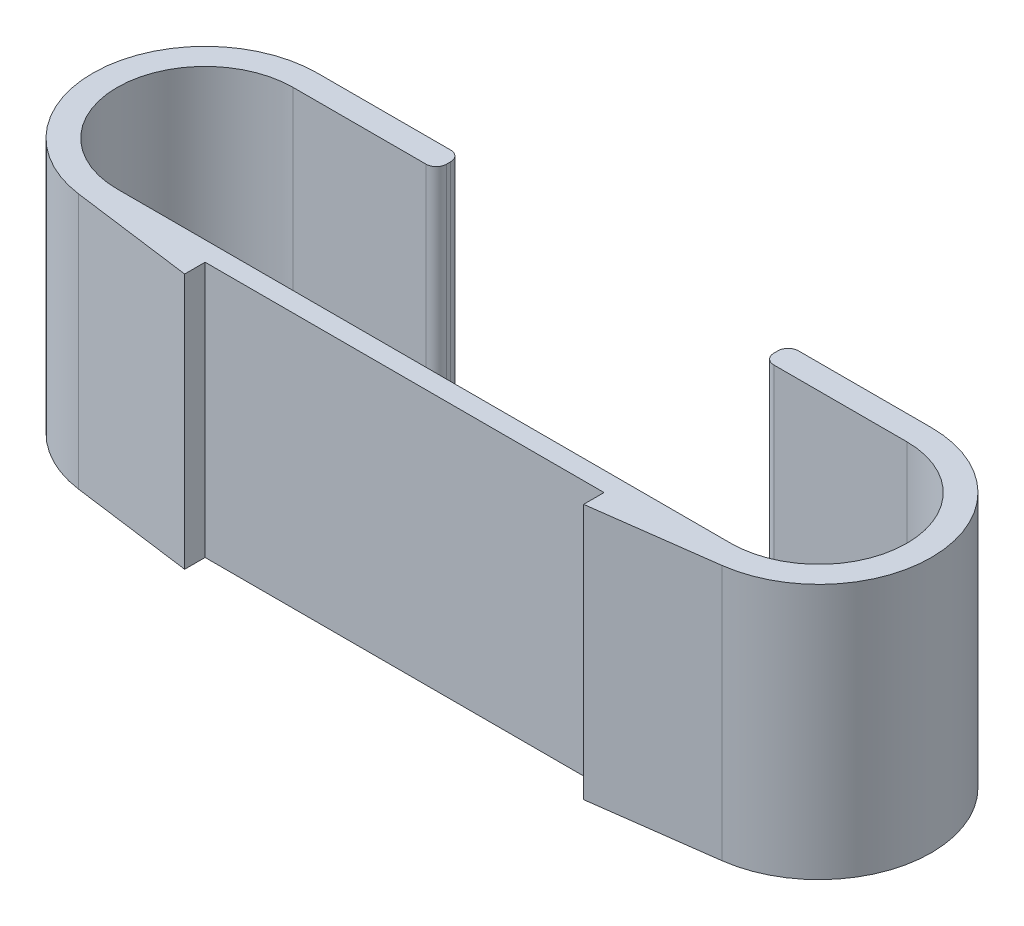
ISO-10303-21;
HEADER;
FILE_DESCRIPTION(('STEP AP214'),'2;1');
FILE_NAME('part.step','',(''),(''),'','','');
FILE_SCHEMA(('AUTOMOTIVE_DESIGN { 1 0 10303 214 1 1 1 1 }'));
ENDSEC;
DATA;
#1=APPLICATION_CONTEXT('core data for automotive mechanical design processes');
#2=APPLICATION_PROTOCOL_DEFINITION('international standard','automotive_design',2000,#1);
#3=PRODUCT_CONTEXT('',#1,'mechanical');
#4=PRODUCT('Part','Part','',(#3));
#5=PRODUCT_RELATED_PRODUCT_CATEGORY('part','',(#4));
#6=PRODUCT_DEFINITION_FORMATION('','',#4);
#7=PRODUCT_DEFINITION_CONTEXT('part definition',#1,'design');
#8=PRODUCT_DEFINITION('design','',#6,#7);
#9=PRODUCT_DEFINITION_SHAPE('','',#8);
#10=(LENGTH_UNIT() NAMED_UNIT(*) SI_UNIT(.MILLI.,.METRE.));
#11=(NAMED_UNIT(*) PLANE_ANGLE_UNIT() SI_UNIT($,.RADIAN.));
#12=(NAMED_UNIT(*) SI_UNIT($,.STERADIAN.) SOLID_ANGLE_UNIT());
#13=UNCERTAINTY_MEASURE_WITH_UNIT(LENGTH_MEASURE(1.E-05),#10,'distance_accuracy_value','');
#14=(GEOMETRIC_REPRESENTATION_CONTEXT(3) GLOBAL_UNCERTAINTY_ASSIGNED_CONTEXT((#13)) GLOBAL_UNIT_ASSIGNED_CONTEXT((#10,
#11,#12)) REPRESENTATION_CONTEXT('',''));
#15=CARTESIAN_POINT('',(0.,0.,0.));
#16=DIRECTION('',(0.,0.,1.));
#17=DIRECTION('',(1.,0.,0.));
#18=AXIS2_PLACEMENT_3D('',#15,#16,#17);
#19=CARTESIAN_POINT('',(30.,25.,-11.));
#20=DIRECTION('',(0.,-1.,0.));
#21=DIRECTION('',(0.,0.,-1.));
#22=AXIS2_PLACEMENT_3D('',#19,#20,#21);
#23=CYLINDRICAL_SURFACE('',#22,8.6);
#24=DIRECTION('',(0.,-1.,0.));
#25=VECTOR('',#24,1.);
#26=CARTESIAN_POINT('',(30.,25.,-19.6));
#27=LINE('',#26,#25);
#28=CARTESIAN_POINT('',(30.,25.,-19.6));
#29=VERTEX_POINT('',#28);
#30=CARTESIAN_POINT('',(30.,1.2,-19.6));
#31=VERTEX_POINT('',#30);
#32=EDGE_CURVE('E336',#29,#31,#27,.T.);
#33=ORIENTED_EDGE('',*,*,#32,.T.);
#34=CARTESIAN_POINT('',(30.,1.2,-11.));
#35=DIRECTION('',(0.,-1.,0.));
#36=DIRECTION('',(0.,0.,-1.));
#37=AXIS2_PLACEMENT_3D('',#34,#35,#36);
#38=CIRCLE('',#37,8.6);
#39=CARTESIAN_POINT('',(30.,1.2,-2.4));
#40=VERTEX_POINT('',#39);
#41=EDGE_CURVE('E289',#31,#40,#38,.T.);
#42=ORIENTED_EDGE('',*,*,#41,.T.);
#43=DIRECTION('',(0.,-1.,0.));
#44=VECTOR('',#43,1.);
#45=CARTESIAN_POINT('',(30.,25.,-2.4));
#46=LINE('',#45,#44);
#47=CARTESIAN_POINT('',(30.,25.,-2.4));
#48=VERTEX_POINT('',#47);
#49=EDGE_CURVE('E333',#48,#40,#46,.T.);
#50=ORIENTED_EDGE('',*,*,#49,.F.);
#51=CARTESIAN_POINT('',(30.,25.,-11.));
#52=DIRECTION('',(0.,-1.,0.));
#53=DIRECTION('',(-1.,0.,0.));
#54=AXIS2_PLACEMENT_3D('',#51,#52,#53);
#55=CIRCLE('',#54,8.6);
#56=EDGE_CURVE('E301',#48,#29,#55,.F.);
#57=ORIENTED_EDGE('',*,*,#56,.T.);
#58=EDGE_LOOP('',(#33,#42,#50,#57));
#59=FACE_BOUND('',#58,.T.);
#60=ADVANCED_FACE('F41',(#59),#23,.F.);
#61=CARTESIAN_POINT('',(-30.,25.,-11.));
#62=DIRECTION('',(0.,-1.,0.));
#63=DIRECTION('',(0.,0.,-1.));
#64=AXIS2_PLACEMENT_3D('',#61,#62,#63);
#65=CYLINDRICAL_SURFACE('',#64,11.);
#66=CARTESIAN_POINT('',(-30.,0.,-11.));
#67=DIRECTION('',(0.,-1.,0.));
#68=DIRECTION('',(0.,0.,-1.));
#69=AXIS2_PLACEMENT_3D('',#66,#67,#68);
#70=CIRCLE('',#69,11.);
#71=CARTESIAN_POINT('',(-31.4561781848013,0.,-0.0968103247669376));
#72=VERTEX_POINT('',#71);
#73=CARTESIAN_POINT('',(-30.,0.,-22.));
#74=VERTEX_POINT('',#73);
#75=EDGE_CURVE('E397',#72,#74,#70,.T.);
#76=ORIENTED_EDGE('',*,*,#75,.F.);
#77=DIRECTION('',(0.,-1.,0.));
#78=VECTOR('',#77,1.);
#79=CARTESIAN_POINT('',(-31.4561781848013,37.0623380818148,-0.0968103247669366));
#80=LINE('',#79,#78);
#81=CARTESIAN_POINT('',(-31.4561781848013,25.,-0.0968103247669376));
#82=VERTEX_POINT('',#81);
#83=EDGE_CURVE('E350',#82,#72,#80,.T.);
#84=ORIENTED_EDGE('',*,*,#83,.F.);
#85=CARTESIAN_POINT('',(-30.,25.,-11.));
#86=DIRECTION('',(0.,-1.,0.));
#87=DIRECTION('',(0.,0.,-1.));
#88=AXIS2_PLACEMENT_3D('',#85,#86,#87);
#89=CIRCLE('',#88,11.);
#90=CARTESIAN_POINT('',(-30.,25.,-22.));
#91=VERTEX_POINT('',#90);
#92=EDGE_CURVE('E377',#82,#91,#89,.T.);
#93=ORIENTED_EDGE('',*,*,#92,.T.);
#94=DIRECTION('',(0.,-1.,0.));
#95=VECTOR('',#94,1.);
#96=CARTESIAN_POINT('',(-30.,25.,-22.));
#97=LINE('',#96,#95);
#98=EDGE_CURVE('E409',#91,#74,#97,.T.);
#99=ORIENTED_EDGE('',*,*,#98,.T.);
#100=EDGE_LOOP('',(#76,#84,#93,#99));
#101=FACE_BOUND('',#100,.T.);
#102=ADVANCED_FACE('F607',(#101),#65,.T.);
#103=CARTESIAN_POINT('',(-30.,25.,-11.));
#104=DIRECTION('',(0.,-1.,0.));
#105=DIRECTION('',(0.,0.,-1.));
#106=AXIS2_PLACEMENT_3D('',#103,#104,#105);
#107=CYLINDRICAL_SURFACE('',#106,8.6);
#108=CARTESIAN_POINT('',(-30.,1.2,-11.));
#109=DIRECTION('',(0.,-1.,0.));
#110=DIRECTION('',(0.,0.,-1.));
#111=AXIS2_PLACEMENT_3D('',#108,#109,#110);
#112=CIRCLE('',#111,8.6);
#113=CARTESIAN_POINT('',(-30.,1.2,-19.6));
#114=VERTEX_POINT('',#113);
#115=CARTESIAN_POINT('',(-30.,1.2,-2.4));
#116=VERTEX_POINT('',#115);
#117=EDGE_CURVE('E413',#114,#116,#112,.F.);
#118=ORIENTED_EDGE('',*,*,#117,.F.);
#119=DIRECTION('',(0.,-1.,0.));
#120=VECTOR('',#119,1.);
#121=CARTESIAN_POINT('',(-30.,25.,-19.6));
#122=LINE('',#121,#120);
#123=CARTESIAN_POINT('',(-30.,25.,-19.6));
#124=VERTEX_POINT('',#123);
#125=EDGE_CURVE('E386',#124,#114,#122,.T.);
#126=ORIENTED_EDGE('',*,*,#125,.F.);
#127=CARTESIAN_POINT('',(-30.,25.,-11.));
#128=DIRECTION('',(0.,1.,0.));
#129=DIRECTION('',(1.,0.,0.));
#130=AXIS2_PLACEMENT_3D('',#127,#128,#129);
#131=CIRCLE('',#130,8.6);
#132=CARTESIAN_POINT('',(-30.,25.,-2.4));
#133=VERTEX_POINT('',#132);
#134=EDGE_CURVE('E383',#133,#124,#131,.F.);
#135=ORIENTED_EDGE('',*,*,#134,.F.);
#136=DIRECTION('',(0.,-1.,0.));
#137=VECTOR('',#136,1.);
#138=CARTESIAN_POINT('',(-30.,25.,-2.4));
#139=LINE('',#138,#137);
#140=EDGE_CURVE('E405',#133,#116,#139,.T.);
#141=ORIENTED_EDGE('',*,*,#140,.T.);
#142=EDGE_LOOP('',(#118,#126,#135,#141));
#143=FACE_BOUND('',#142,.T.);
#144=ADVANCED_FACE('F628',(#143),#107,.F.);
#145=CARTESIAN_POINT('',(-30.,25.,-19.6));
#146=DIRECTION('',(0.,0.,-1.));
#147=DIRECTION('',(-1.,0.,0.));
#148=AXIS2_PLACEMENT_3D('',#145,#146,#147);
#149=PLANE('',#148);
#150=ORIENTED_EDGE('',*,*,#125,.T.);
#151=DIRECTION('',(1.,0.,0.));
#152=VECTOR('',#151,1.);
#153=CARTESIAN_POINT('',(-30.,1.2,-19.6));
#154=LINE('',#153,#152);
#155=CARTESIAN_POINT('',(-25.,1.2,-19.6));
#156=VERTEX_POINT('',#155);
#157=EDGE_CURVE('E57',#114,#156,#154,.T.);
#158=ORIENTED_EDGE('',*,*,#157,.T.);
#159=DIRECTION('',(0.,1.,0.));
#160=VECTOR('',#159,1.);
#161=CARTESIAN_POINT('',(-25.,0.,-19.6));
#162=LINE('',#161,#160);
#163=CARTESIAN_POINT('',(-25.,0.,-19.6));
#164=VERTEX_POINT('',#163);
#165=EDGE_CURVE('E504',#156,#164,#162,.F.);
#166=ORIENTED_EDGE('',*,*,#165,.T.);
#167=DIRECTION('',(1.,0.,0.));
#168=VECTOR('',#167,1.);
#169=CARTESIAN_POINT('',(-30.,0.,-19.6));
#170=LINE('',#169,#168);
#171=CARTESIAN_POINT('',(-17.,0.,-19.6));
#172=VERTEX_POINT('',#171);
#173=EDGE_CURVE('E360',#164,#172,#170,.T.);
#174=ORIENTED_EDGE('',*,*,#173,.T.);
#175=DIRECTION('',(0.,-1.,0.));
#176=VECTOR('',#175,1.);
#177=CARTESIAN_POINT('',(-17.,25.,-19.6));
#178=LINE('',#177,#176);
#179=CARTESIAN_POINT('',(-17.,25.,-19.6));
#180=VERTEX_POINT('',#179);
#181=EDGE_CURVE('E452',#172,#180,#178,.F.);
#182=ORIENTED_EDGE('',*,*,#181,.T.);
#183=DIRECTION('',(1.,0.,0.));
#184=VECTOR('',#183,1.);
#185=CARTESIAN_POINT('',(-30.,25.,-19.6));
#186=LINE('',#185,#184);
#187=EDGE_CURVE('E364',#124,#180,#186,.T.);
#188=ORIENTED_EDGE('',*,*,#187,.F.);
#189=EDGE_LOOP('',(#150,#158,#166,#174,#182,#188));
#190=FACE_BOUND('',#189,.T.);
#191=ADVANCED_FACE('F533',(#190),#149,.F.);
#192=CARTESIAN_POINT('',(-16.,25.,-22.));
#193=DIRECTION('',(1.,0.,0.));
#194=DIRECTION('',(0.,0.,-1.));
#195=AXIS2_PLACEMENT_3D('',#192,#193,#194);
#196=PLANE('',#195);
#197=DIRECTION('',(0.,0.,1.));
#198=VECTOR('',#197,1.);
#199=CARTESIAN_POINT('',(-16.,0.,-22.));
#200=LINE('',#199,#198);
#201=CARTESIAN_POINT('',(-16.,0.,-21.));
#202=VERTEX_POINT('',#201);
#203=CARTESIAN_POINT('',(-16.,0.,-20.6));
#204=VERTEX_POINT('',#203);
#205=EDGE_CURVE('E389',#202,#204,#200,.T.);
#206=ORIENTED_EDGE('',*,*,#205,.F.);
#207=DIRECTION('',(0.,-1.,0.));
#208=VECTOR('',#207,1.);
#209=CARTESIAN_POINT('',(-16.,25.,-21.));
#210=LINE('',#209,#208);
#211=CARTESIAN_POINT('',(-16.,25.,-21.));
#212=VERTEX_POINT('',#211);
#213=EDGE_CURVE('E437',#202,#212,#210,.F.);
#214=ORIENTED_EDGE('',*,*,#213,.T.);
#215=DIRECTION('',(0.,0.,1.));
#216=VECTOR('',#215,1.);
#217=CARTESIAN_POINT('',(-16.,25.,-22.));
#218=LINE('',#217,#216);
#219=CARTESIAN_POINT('',(-16.,25.,-20.6));
#220=VERTEX_POINT('',#219);
#221=EDGE_CURVE('E368',#212,#220,#218,.T.);
#222=ORIENTED_EDGE('',*,*,#221,.T.);
#223=DIRECTION('',(0.,-1.,0.));
#224=VECTOR('',#223,1.);
#225=CARTESIAN_POINT('',(-16.,0.,-20.6));
#226=LINE('',#225,#224);
#227=EDGE_CURVE('E433',#220,#204,#226,.T.);
#228=ORIENTED_EDGE('',*,*,#227,.T.);
#229=EDGE_LOOP('',(#206,#214,#222,#228));
#230=FACE_BOUND('',#229,.T.);
#231=ADVANCED_FACE('F617',(#230),#196,.T.);
#232=CARTESIAN_POINT('',(-30.,25.,-22.));
#233=DIRECTION('',(0.,0.,-1.));
#234=DIRECTION('',(-1.,0.,0.));
#235=AXIS2_PLACEMENT_3D('',#232,#233,#234);
#236=PLANE('',#235);
#237=DIRECTION('',(1.,0.,0.));
#238=VECTOR('',#237,1.);
#239=CARTESIAN_POINT('',(-30.,25.,-22.));
#240=LINE('',#239,#238);
#241=CARTESIAN_POINT('',(-17.,25.,-22.));
#242=VERTEX_POINT('',#241);
#243=EDGE_CURVE('E373',#91,#242,#240,.T.);
#244=ORIENTED_EDGE('',*,*,#243,.T.);
#245=DIRECTION('',(0.,-1.,0.));
#246=VECTOR('',#245,1.);
#247=CARTESIAN_POINT('',(-17.,25.,-22.));
#248=LINE('',#247,#246);
#249=CARTESIAN_POINT('',(-17.,0.,-22.));
#250=VERTEX_POINT('',#249);
#251=EDGE_CURVE('E416',#242,#250,#248,.T.);
#252=ORIENTED_EDGE('',*,*,#251,.T.);
#253=DIRECTION('',(1.,0.,0.));
#254=VECTOR('',#253,1.);
#255=CARTESIAN_POINT('',(-30.,0.,-22.));
#256=LINE('',#255,#254);
#257=EDGE_CURVE('E393',#74,#250,#256,.T.);
#258=ORIENTED_EDGE('',*,*,#257,.F.);
#259=ORIENTED_EDGE('',*,*,#98,.F.);
#260=EDGE_LOOP('',(#244,#252,#258,#259));
#261=FACE_BOUND('',#260,.T.);
#262=ADVANCED_FACE('F609',(#261),#236,.T.);
#263=CARTESIAN_POINT('',(0.,25.,-2.4));
#264=DIRECTION('',(0.,0.,1.));
#265=DIRECTION('',(1.,0.,0.));
#266=AXIS2_PLACEMENT_3D('',#263,#264,#265);
#267=PLANE('',#266);
#268=ORIENTED_EDGE('',*,*,#49,.T.);
#269=DIRECTION('',(-1.,0.,0.));
#270=VECTOR('',#269,1.);
#271=CARTESIAN_POINT('',(30.,1.2,-2.4));
#272=LINE('',#271,#270);
#273=CARTESIAN_POINT('',(25.,1.2,-2.4));
#274=VERTEX_POINT('',#273);
#275=EDGE_CURVE('E65',#40,#274,#272,.T.);
#276=ORIENTED_EDGE('',*,*,#275,.T.);
#277=DIRECTION('',(0.,1.,0.));
#278=VECTOR('',#277,1.);
#279=CARTESIAN_POINT('',(25.,25.,-2.4));
#280=LINE('',#279,#278);
#281=CARTESIAN_POINT('',(25.,0.,-2.4));
#282=VERTEX_POINT('',#281);
#283=EDGE_CURVE('E484',#274,#282,#280,.F.);
#284=ORIENTED_EDGE('',*,*,#283,.T.);
#285=DIRECTION('',(-1.,0.,0.));
#286=VECTOR('',#285,1.);
#287=CARTESIAN_POINT('',(0.,0.,-2.4));
#288=LINE('',#287,#286);
#289=CARTESIAN_POINT('',(-25.,0.,-2.4));
#290=VERTEX_POINT('',#289);
#291=EDGE_CURVE('E369',#282,#290,#288,.T.);
#292=ORIENTED_EDGE('',*,*,#291,.T.);
#293=DIRECTION('',(0.,-1.,0.));
#294=VECTOR('',#293,1.);
#295=CARTESIAN_POINT('',(-25.,1.2,-2.4));
#296=LINE('',#295,#294);
#297=CARTESIAN_POINT('',(-25.,1.2,-2.4));
#298=VERTEX_POINT('',#297);
#299=EDGE_CURVE('E480',#290,#298,#296,.F.);
#300=ORIENTED_EDGE('',*,*,#299,.T.);
#301=DIRECTION('',(-1.,0.,0.));
#302=VECTOR('',#301,1.);
#303=CARTESIAN_POINT('',(-30.,1.2,-2.4));
#304=LINE('',#303,#302);
#305=EDGE_CURVE('E477',#298,#116,#304,.T.);
#306=ORIENTED_EDGE('',*,*,#305,.T.);
#307=ORIENTED_EDGE('',*,*,#140,.F.);
#308=DIRECTION('',(-1.,0.,0.));
#309=VECTOR('',#308,1.);
#310=CARTESIAN_POINT('',(0.,25.,-2.4));
#311=LINE('',#310,#309);
#312=EDGE_CURVE('E380',#48,#133,#311,.T.);
#313=ORIENTED_EDGE('',*,*,#312,.F.);
#314=EDGE_LOOP('',(#268,#276,#284,#292,#300,#306,#307,#313));
#315=FACE_BOUND('',#314,.T.);
#316=ADVANCED_FACE('F550',(#315),#267,.F.);
#317=CARTESIAN_POINT('',(-30.,25.,-11.));
#318=DIRECTION('',(0.,-1.,0.));
#319=DIRECTION('',(-1.,0.,0.));
#320=AXIS2_PLACEMENT_3D('',#317,#318,#319);
#321=PLANE('',#320);
#322=DIRECTION('',(0.,0.,1.));
#323=VECTOR('',#322,1.);
#324=CARTESIAN_POINT('',(-19.5,25.,0.));
#325=LINE('',#324,#323);
#326=CARTESIAN_POINT('',(-19.5000000000421,25.,-0.5));
#327=VERTEX_POINT('',#326);
#328=CARTESIAN_POINT('',(-19.5,25.,1.5));
#329=VERTEX_POINT('',#328);
#330=EDGE_CURVE('E345',#327,#329,#325,.T.);
#331=ORIENTED_EDGE('',*,*,#330,.F.);
#332=DIRECTION('',(-1.,0.,0.));
#333=VECTOR('',#332,1.);
#334=CARTESIAN_POINT('',(-19.5000000000421,25.,-0.5));
#335=LINE('',#334,#333);
#336=CARTESIAN_POINT('',(19.5,25.,-0.5));
#337=VERTEX_POINT('',#336);
#338=EDGE_CURVE('E249',#337,#327,#335,.T.);
#339=ORIENTED_EDGE('',*,*,#338,.F.);
#340=DIRECTION('',(0.,0.,1.));
#341=VECTOR('',#340,1.);
#342=CARTESIAN_POINT('',(19.5,25.,0.));
#343=LINE('',#342,#341);
#344=CARTESIAN_POINT('',(19.5,25.,1.5));
#345=VERTEX_POINT('',#344);
#346=EDGE_CURVE('E265',#337,#345,#343,.T.);
#347=ORIENTED_EDGE('',*,*,#346,.T.);
#348=DIRECTION('',(0.991199061384824,0.,-0.132379834981934));
#349=VECTOR('',#348,1.);
#350=CARTESIAN_POINT('',(19.5,25.,1.5));
#351=LINE('',#350,#349);
#352=CARTESIAN_POINT('',(31.4561781848013,25.,-0.0968103247669418));
#353=VERTEX_POINT('',#352);
#354=EDGE_CURVE('E268',#345,#353,#351,.T.);
#355=ORIENTED_EDGE('',*,*,#354,.T.);
#356=CARTESIAN_POINT('',(30.,25.,-11.));
#357=DIRECTION('',(0.,1.,0.));
#358=DIRECTION('',(0.,0.,-1.));
#359=AXIS2_PLACEMENT_3D('',#356,#357,#358);
#360=CIRCLE('',#359,11.);
#361=CARTESIAN_POINT('',(30.,25.,-22.));
#362=VERTEX_POINT('',#361);
#363=EDGE_CURVE('E306',#353,#362,#360,.T.);
#364=ORIENTED_EDGE('',*,*,#363,.T.);
#365=DIRECTION('',(-1.,0.,0.));
#366=VECTOR('',#365,1.);
#367=CARTESIAN_POINT('',(30.,25.,-22.));
#368=LINE('',#367,#366);
#369=CARTESIAN_POINT('',(17.,25.,-22.));
#370=VERTEX_POINT('',#369);
#371=EDGE_CURVE('E309',#362,#370,#368,.T.);
#372=ORIENTED_EDGE('',*,*,#371,.T.);
#373=CARTESIAN_POINT('',(17.,25.,-21.));
#374=DIRECTION('',(0.,-1.,0.));
#375=DIRECTION('',(0.,0.,-1.));
#376=AXIS2_PLACEMENT_3D('',#373,#374,#375);
#377=CIRCLE('',#376,1.);
#378=CARTESIAN_POINT('',(16.,25.,-21.));
#379=VERTEX_POINT('',#378);
#380=EDGE_CURVE('E443',#370,#379,#377,.F.);
#381=ORIENTED_EDGE('',*,*,#380,.T.);
#382=DIRECTION('',(0.,0.,1.));
#383=VECTOR('',#382,1.);
#384=CARTESIAN_POINT('',(16.,25.,-22.));
#385=LINE('',#384,#383);
#386=CARTESIAN_POINT('',(16.,25.,-20.6));
#387=VERTEX_POINT('',#386);
#388=EDGE_CURVE('E313',#379,#387,#385,.T.);
#389=ORIENTED_EDGE('',*,*,#388,.T.);
#390=CARTESIAN_POINT('',(17.,25.,-20.6));
#391=DIRECTION('',(0.,-1.,0.));
#392=DIRECTION('',(0.,0.,-1.));
#393=AXIS2_PLACEMENT_3D('',#390,#391,#392);
#394=CIRCLE('',#393,1.);
#395=CARTESIAN_POINT('',(17.,25.,-19.6));
#396=VERTEX_POINT('',#395);
#397=EDGE_CURVE('E440',#387,#396,#394,.F.);
#398=ORIENTED_EDGE('',*,*,#397,.T.);
#399=DIRECTION('',(-1.,0.,0.));
#400=VECTOR('',#399,1.);
#401=CARTESIAN_POINT('',(30.,25.,-19.6));
#402=LINE('',#401,#400);
#403=EDGE_CURVE('E297',#29,#396,#402,.T.);
#404=ORIENTED_EDGE('',*,*,#403,.F.);
#405=ORIENTED_EDGE('',*,*,#56,.F.);
#406=ORIENTED_EDGE('',*,*,#312,.T.);
#407=ORIENTED_EDGE('',*,*,#134,.T.);
#408=ORIENTED_EDGE('',*,*,#187,.T.);
#409=CARTESIAN_POINT('',(-17.,25.,-20.6));
#410=DIRECTION('',(0.,-1.,0.));
#411=DIRECTION('',(0.,0.,-1.));
#412=AXIS2_PLACEMENT_3D('',#409,#410,#411);
#413=CIRCLE('',#412,1.);
#414=EDGE_CURVE('E446',#180,#220,#413,.F.);
#415=ORIENTED_EDGE('',*,*,#414,.T.);
#416=ORIENTED_EDGE('',*,*,#221,.F.);
#417=CARTESIAN_POINT('',(-17.,25.,-21.));
#418=DIRECTION('',(0.,-1.,0.));
#419=DIRECTION('',(0.,0.,-1.));
#420=AXIS2_PLACEMENT_3D('',#417,#418,#419);
#421=CIRCLE('',#420,1.);
#422=EDGE_CURVE('E449',#212,#242,#421,.F.);
#423=ORIENTED_EDGE('',*,*,#422,.T.);
#424=ORIENTED_EDGE('',*,*,#243,.F.);
#425=ORIENTED_EDGE('',*,*,#92,.F.);
#426=DIRECTION('',(-0.991199061384824,0.,-0.132379834981933));
#427=VECTOR('',#426,1.);
#428=CARTESIAN_POINT('',(-19.5,25.,1.5));
#429=LINE('',#428,#427);
#430=EDGE_CURVE('E340',#329,#82,#429,.T.);
#431=ORIENTED_EDGE('',*,*,#430,.F.);
#432=EDGE_LOOP('',(#331,#339,#347,#355,#364,#372,#381,#389,#398,#404,#405,#406,#407,#408,#415,
#416,#423,#424,#425,#431));
#433=FACE_BOUND('',#432,.T.);
#434=ADVANCED_FACE('F599',(#433),#321,.F.);
#435=CARTESIAN_POINT('',(-30.,0.,-11.));
#436=DIRECTION('',(0.,-1.,0.));
#437=DIRECTION('',(-1.,0.,0.));
#438=AXIS2_PLACEMENT_3D('',#435,#436,#437);
#439=PLANE('',#438);
#440=DIRECTION('',(1.,0.,0.));
#441=VECTOR('',#440,1.);
#442=CARTESIAN_POINT('',(-19.5000000000421,0.,-0.5));
#443=LINE('',#442,#441);
#444=CARTESIAN_POINT('',(-19.5000000000421,0.,-0.5));
#445=VERTEX_POINT('',#444);
#446=CARTESIAN_POINT('',(19.5,0.,-0.5));
#447=VERTEX_POINT('',#446);
#448=EDGE_CURVE('E247',#445,#447,#443,.T.);
#449=ORIENTED_EDGE('',*,*,#448,.F.);
#450=DIRECTION('',(0.,0.,-1.));
#451=VECTOR('',#450,1.);
#452=CARTESIAN_POINT('',(-19.5,0.,0.));
#453=LINE('',#452,#451);
#454=CARTESIAN_POINT('',(-19.5,0.,1.5));
#455=VERTEX_POINT('',#454);
#456=EDGE_CURVE('E228',#455,#445,#453,.T.);
#457=ORIENTED_EDGE('',*,*,#456,.F.);
#458=DIRECTION('',(0.991199061384824,0.,0.132379834981933));
#459=VECTOR('',#458,1.);
#460=CARTESIAN_POINT('',(-19.5,0.,1.5));
#461=LINE('',#460,#459);
#462=EDGE_CURVE('E241',#72,#455,#461,.T.);
#463=ORIENTED_EDGE('',*,*,#462,.F.);
#464=ORIENTED_EDGE('',*,*,#75,.T.);
#465=ORIENTED_EDGE('',*,*,#257,.T.);
#466=CARTESIAN_POINT('',(-17.,0.,-21.));
#467=DIRECTION('',(0.,-1.,0.));
#468=DIRECTION('',(0.,0.,-1.));
#469=AXIS2_PLACEMENT_3D('',#466,#467,#468);
#470=CIRCLE('',#469,1.);
#471=EDGE_CURVE('E430',#250,#202,#470,.T.);
#472=ORIENTED_EDGE('',*,*,#471,.T.);
#473=ORIENTED_EDGE('',*,*,#205,.T.);
#474=CARTESIAN_POINT('',(-17.,0.,-20.6));
#475=DIRECTION('',(0.,-1.,0.));
#476=DIRECTION('',(0.,0.,-1.));
#477=AXIS2_PLACEMENT_3D('',#474,#475,#476);
#478=CIRCLE('',#477,1.);
#479=EDGE_CURVE('E426',#204,#172,#478,.T.);
#480=ORIENTED_EDGE('',*,*,#479,.T.);
#481=ORIENTED_EDGE('',*,*,#173,.F.);
#482=CARTESIAN_POINT('',(-25.,0.,-14.6));
#483=DIRECTION('',(0.,-1.,0.));
#484=DIRECTION('',(0.,0.,-1.));
#485=AXIS2_PLACEMENT_3D('',#482,#483,#484);
#486=CIRCLE('',#485,5.);
#487=CARTESIAN_POINT('',(-30.,0.,-14.6));
#488=VERTEX_POINT('',#487);
#489=EDGE_CURVE('E11',#164,#488,#486,.F.);
#490=ORIENTED_EDGE('',*,*,#489,.T.);
#491=DIRECTION('',(0.,0.,-1.));
#492=VECTOR('',#491,1.);
#493=CARTESIAN_POINT('',(-30.,0.,-22.));
#494=LINE('',#493,#492);
#495=CARTESIAN_POINT('',(-30.,0.,-7.4));
#496=VERTEX_POINT('',#495);
#497=EDGE_CURVE('E344',#496,#488,#494,.T.);
#498=ORIENTED_EDGE('',*,*,#497,.F.);
#499=CARTESIAN_POINT('',(-25.,0.,-7.4));
#500=DIRECTION('',(0.,-1.,0.));
#501=DIRECTION('',(0.,0.,-1.));
#502=AXIS2_PLACEMENT_3D('',#499,#500,#501);
#503=CIRCLE('',#502,5.);
#504=EDGE_CURVE('E515',#496,#290,#503,.F.);
#505=ORIENTED_EDGE('',*,*,#504,.T.);
#506=ORIENTED_EDGE('',*,*,#291,.F.);
#507=CARTESIAN_POINT('',(25.,0.,-7.4));
#508=DIRECTION('',(0.,-1.,0.));
#509=DIRECTION('',(0.,0.,-1.));
#510=AXIS2_PLACEMENT_3D('',#507,#508,#509);
#511=CIRCLE('',#510,5.);
#512=CARTESIAN_POINT('',(30.,0.,-7.4));
#513=VERTEX_POINT('',#512);
#514=EDGE_CURVE('E512',#282,#513,#511,.F.);
#515=ORIENTED_EDGE('',*,*,#514,.T.);
#516=DIRECTION('',(0.,0.,-1.));
#517=VECTOR('',#516,1.);
#518=CARTESIAN_POINT('',(30.,0.,-22.));
#519=LINE('',#518,#517);
#520=CARTESIAN_POINT('',(30.,0.,-14.6));
#521=VERTEX_POINT('',#520);
#522=EDGE_CURVE('E284',#513,#521,#519,.T.);
#523=ORIENTED_EDGE('',*,*,#522,.T.);
#524=CARTESIAN_POINT('',(25.,0.,-14.6));
#525=DIRECTION('',(0.,-1.,0.));
#526=DIRECTION('',(0.,0.,-1.));
#527=AXIS2_PLACEMENT_3D('',#524,#525,#526);
#528=CIRCLE('',#527,5.);
#529=CARTESIAN_POINT('',(25.,0.,-19.6));
#530=VERTEX_POINT('',#529);
#531=EDGE_CURVE('E521',#521,#530,#528,.F.);
#532=ORIENTED_EDGE('',*,*,#531,.T.);
#533=DIRECTION('',(-1.,0.,0.));
#534=VECTOR('',#533,1.);
#535=CARTESIAN_POINT('',(30.,0.,-19.6));
#536=LINE('',#535,#534);
#537=CARTESIAN_POINT('',(17.,0.,-19.6));
#538=VERTEX_POINT('',#537);
#539=EDGE_CURVE('E296',#530,#538,#536,.T.);
#540=ORIENTED_EDGE('',*,*,#539,.T.);
#541=CARTESIAN_POINT('',(17.,0.,-20.6));
#542=DIRECTION('',(0.,-1.,0.));
#543=DIRECTION('',(0.,0.,-1.));
#544=AXIS2_PLACEMENT_3D('',#541,#542,#543);
#545=CIRCLE('',#544,1.);
#546=CARTESIAN_POINT('',(16.,0.,-20.6));
#547=VERTEX_POINT('',#546);
#548=EDGE_CURVE('E420',#538,#547,#545,.T.);
#549=ORIENTED_EDGE('',*,*,#548,.T.);
#550=DIRECTION('',(0.,0.,1.));
#551=VECTOR('',#550,1.);
#552=CARTESIAN_POINT('',(16.,0.,-22.));
#553=LINE('',#552,#551);
#554=CARTESIAN_POINT('',(16.,0.,-21.));
#555=VERTEX_POINT('',#554);
#556=EDGE_CURVE('E302',#555,#547,#553,.T.);
#557=ORIENTED_EDGE('',*,*,#556,.F.);
#558=CARTESIAN_POINT('',(17.,0.,-21.));
#559=DIRECTION('',(0.,-1.,0.));
#560=DIRECTION('',(0.,0.,-1.));
#561=AXIS2_PLACEMENT_3D('',#558,#559,#560);
#562=CIRCLE('',#561,1.);
#563=CARTESIAN_POINT('',(17.,0.,-22.));
#564=VERTEX_POINT('',#563);
#565=EDGE_CURVE('E423',#555,#564,#562,.T.);
#566=ORIENTED_EDGE('',*,*,#565,.T.);
#567=DIRECTION('',(-1.,0.,0.));
#568=VECTOR('',#567,1.);
#569=CARTESIAN_POINT('',(30.,0.,-22.));
#570=LINE('',#569,#568);
#571=CARTESIAN_POINT('',(30.,0.,-22.));
#572=VERTEX_POINT('',#571);
#573=EDGE_CURVE('E323',#572,#564,#570,.T.);
#574=ORIENTED_EDGE('',*,*,#573,.F.);
#575=CARTESIAN_POINT('',(30.,0.,-11.));
#576=DIRECTION('',(0.,1.,0.));
#577=DIRECTION('',(0.,0.,-1.));
#578=AXIS2_PLACEMENT_3D('',#575,#576,#577);
#579=CIRCLE('',#578,11.);
#580=CARTESIAN_POINT('',(31.4561781848013,0.,-0.0968103247669443));
#581=VERTEX_POINT('',#580);
#582=EDGE_CURVE('E320',#581,#572,#579,.T.);
#583=ORIENTED_EDGE('',*,*,#582,.F.);
#584=DIRECTION('',(-0.991199061384824,0.,0.132379834981934));
#585=VECTOR('',#584,1.);
#586=CARTESIAN_POINT('',(19.5,0.,1.5));
#587=LINE('',#586,#585);
#588=CARTESIAN_POINT('',(19.5,0.,1.5));
#589=VERTEX_POINT('',#588);
#590=EDGE_CURVE('E272',#581,#589,#587,.T.);
#591=ORIENTED_EDGE('',*,*,#590,.T.);
#592=DIRECTION('',(0.,0.,-1.));
#593=VECTOR('',#592,1.);
#594=CARTESIAN_POINT('',(19.5,0.,0.));
#595=LINE('',#594,#593);
#596=EDGE_CURVE('E255',#589,#447,#595,.T.);
#597=ORIENTED_EDGE('',*,*,#596,.T.);
#598=EDGE_LOOP('',(#449,#457,#463,#464,#465,#472,#473,#480,#481,#490,#498,#505,#506,#515,#523,
#532,#540,#549,#557,#566,#574,#583,#591,#597));
#599=FACE_BOUND('',#598,.T.);
#600=ADVANCED_FACE('F252',(#599),#439,.T.);
#601=CARTESIAN_POINT('',(-30.,1.2,-11.));
#602=DIRECTION('',(0.,-1.,0.));
#603=DIRECTION('',(0.,0.,-1.));
#604=AXIS2_PLACEMENT_3D('',#601,#602,#603);
#605=PLANE('',#604);
#606=ORIENTED_EDGE('',*,*,#117,.T.);
#607=ORIENTED_EDGE('',*,*,#305,.F.);
#608=CARTESIAN_POINT('',(-25.,1.2,-7.4));
#609=DIRECTION('',(0.,-1.,0.));
#610=DIRECTION('',(0.,0.,-1.));
#611=AXIS2_PLACEMENT_3D('',#608,#609,#610);
#612=CIRCLE('',#611,5.);
#613=CARTESIAN_POINT('',(-30.,1.2,-7.4));
#614=VERTEX_POINT('',#613);
#615=EDGE_CURVE('E518',#298,#614,#612,.T.);
#616=ORIENTED_EDGE('',*,*,#615,.T.);
#617=DIRECTION('',(0.,0.,-1.));
#618=VECTOR('',#617,1.);
#619=CARTESIAN_POINT('',(-30.,1.2,-22.));
#620=LINE('',#619,#618);
#621=CARTESIAN_POINT('',(-30.,1.2,-14.6));
#622=VERTEX_POINT('',#621);
#623=EDGE_CURVE('E356',#614,#622,#620,.T.);
#624=ORIENTED_EDGE('',*,*,#623,.T.);
#625=CARTESIAN_POINT('',(-25.,1.2,-14.6));
#626=DIRECTION('',(0.,-1.,0.));
#627=DIRECTION('',(0.,0.,-1.));
#628=AXIS2_PLACEMENT_3D('',#625,#626,#627);
#629=CIRCLE('',#628,5.);
#630=EDGE_CURVE('E50',#622,#156,#629,.T.);
#631=ORIENTED_EDGE('',*,*,#630,.T.);
#632=ORIENTED_EDGE('',*,*,#157,.F.);
#633=EDGE_LOOP('',(#606,#607,#616,#624,#631,#632));
#634=FACE_BOUND('',#633,.T.);
#635=ADVANCED_FACE('F527',(#634),#605,.F.);
#636=CARTESIAN_POINT('',(-30.,1.2,-22.));
#637=DIRECTION('',(-1.,0.,0.));
#638=DIRECTION('',(0.,0.,1.));
#639=AXIS2_PLACEMENT_3D('',#636,#637,#638);
#640=PLANE('',#639);
#641=ORIENTED_EDGE('',*,*,#623,.F.);
#642=DIRECTION('',(0.,-1.,0.));
#643=VECTOR('',#642,1.);
#644=CARTESIAN_POINT('',(-30.,0.,-7.4));
#645=LINE('',#644,#643);
#646=EDGE_CURVE('E493',#614,#496,#645,.T.);
#647=ORIENTED_EDGE('',*,*,#646,.T.);
#648=ORIENTED_EDGE('',*,*,#497,.T.);
#649=DIRECTION('',(0.,1.,0.));
#650=VECTOR('',#649,1.);
#651=CARTESIAN_POINT('',(-30.,1.2,-14.6));
#652=LINE('',#651,#650);
#653=EDGE_CURVE('E489',#488,#622,#652,.T.);
#654=ORIENTED_EDGE('',*,*,#653,.T.);
#655=EDGE_LOOP('',(#641,#647,#648,#654));
#656=FACE_BOUND('',#655,.T.);
#657=ADVANCED_FACE('F541',(#656),#640,.F.);
#658=CARTESIAN_POINT('',(-19.5,37.0623380818148,0.));
#659=DIRECTION('',(-1.,0.,0.));
#660=DIRECTION('',(0.,0.,1.));
#661=AXIS2_PLACEMENT_3D('',#658,#659,#660);
#662=PLANE('',#661);
#663=ORIENTED_EDGE('',*,*,#456,.T.);
#664=DIRECTION('',(0.,-1.,0.));
#665=VECTOR('',#664,1.);
#666=CARTESIAN_POINT('',(-19.5000000000421,0.,-0.5));
#667=LINE('',#666,#665);
#668=EDGE_CURVE('E232',#327,#445,#667,.T.);
#669=ORIENTED_EDGE('',*,*,#668,.F.);
#670=ORIENTED_EDGE('',*,*,#330,.T.);
#671=DIRECTION('',(0.,-1.,0.));
#672=VECTOR('',#671,1.);
#673=CARTESIAN_POINT('',(-19.5,37.0623380818148,1.5));
#674=LINE('',#673,#672);
#675=EDGE_CURVE('E235',#329,#455,#674,.T.);
#676=ORIENTED_EDGE('',*,*,#675,.T.);
#677=EDGE_LOOP('',(#663,#669,#670,#676));
#678=FACE_BOUND('',#677,.T.);
#679=ADVANCED_FACE('F230',(#678),#662,.F.);
#680=CARTESIAN_POINT('',(-19.5,37.0623380818148,1.5));
#681=DIRECTION('',(0.132379834981933,0.,-0.991199061384824));
#682=DIRECTION('',(-0.991199061384824,0.,-0.132379834981933));
#683=AXIS2_PLACEMENT_3D('',#680,#681,#682);
#684=PLANE('',#683);
#685=ORIENTED_EDGE('',*,*,#675,.F.);
#686=ORIENTED_EDGE('',*,*,#430,.T.);
#687=ORIENTED_EDGE('',*,*,#83,.T.);
#688=ORIENTED_EDGE('',*,*,#462,.T.);
#689=EDGE_LOOP('',(#685,#686,#687,#688));
#690=FACE_BOUND('',#689,.T.);
#691=ADVANCED_FACE('F603',(#690),#684,.F.);
#692=CARTESIAN_POINT('',(30.,25.,-19.6));
#693=DIRECTION('',(0.,0.,1.));
#694=DIRECTION('',(1.,0.,0.));
#695=AXIS2_PLACEMENT_3D('',#692,#693,#694);
#696=PLANE('',#695);
#697=ORIENTED_EDGE('',*,*,#539,.F.);
#698=DIRECTION('',(0.,-1.,0.));
#699=VECTOR('',#698,1.);
#700=CARTESIAN_POINT('',(25.,1.2,-19.6));
#701=LINE('',#700,#699);
#702=CARTESIAN_POINT('',(25.,1.2,-19.6));
#703=VERTEX_POINT('',#702);
#704=EDGE_CURVE('E500',#530,#703,#701,.F.);
#705=ORIENTED_EDGE('',*,*,#704,.T.);
#706=DIRECTION('',(1.,0.,0.));
#707=VECTOR('',#706,1.);
#708=CARTESIAN_POINT('',(30.,1.2,-19.6));
#709=LINE('',#708,#707);
#710=EDGE_CURVE('E497',#703,#31,#709,.T.);
#711=ORIENTED_EDGE('',*,*,#710,.T.);
#712=ORIENTED_EDGE('',*,*,#32,.F.);
#713=ORIENTED_EDGE('',*,*,#403,.T.);
#714=DIRECTION('',(0.,-1.,0.));
#715=VECTOR('',#714,1.);
#716=CARTESIAN_POINT('',(17.,0.,-19.6));
#717=LINE('',#716,#715);
#718=EDGE_CURVE('E465',#396,#538,#717,.T.);
#719=ORIENTED_EDGE('',*,*,#718,.T.);
#720=EDGE_LOOP('',(#697,#705,#711,#712,#713,#719));
#721=FACE_BOUND('',#720,.T.);
#722=ADVANCED_FACE('F567',(#721),#696,.T.);
#723=CARTESIAN_POINT('',(30.,25.,-11.));
#724=DIRECTION('',(0.,-1.,0.));
#725=DIRECTION('',(0.,0.,-1.));
#726=AXIS2_PLACEMENT_3D('',#723,#724,#725);
#727=CYLINDRICAL_SURFACE('',#726,11.);
#728=ORIENTED_EDGE('',*,*,#363,.F.);
#729=DIRECTION('',(0.,-1.,0.));
#730=VECTOR('',#729,1.);
#731=CARTESIAN_POINT('',(31.4561781848013,37.0623380818148,-0.0968103247669443));
#732=LINE('',#731,#730);
#733=EDGE_CURVE('E275',#353,#581,#732,.T.);
#734=ORIENTED_EDGE('',*,*,#733,.T.);
#735=ORIENTED_EDGE('',*,*,#582,.T.);
#736=DIRECTION('',(0.,-1.,0.));
#737=VECTOR('',#736,1.);
#738=CARTESIAN_POINT('',(30.,25.,-22.));
#739=LINE('',#738,#737);
#740=EDGE_CURVE('E317',#362,#572,#739,.T.);
#741=ORIENTED_EDGE('',*,*,#740,.F.);
#742=EDGE_LOOP('',(#728,#734,#735,#741));
#743=FACE_BOUND('',#742,.T.);
#744=ADVANCED_FACE('F591',(#743),#727,.T.);
#745=CARTESIAN_POINT('',(30.,25.,-22.));
#746=DIRECTION('',(0.,0.,1.));
#747=DIRECTION('',(1.,0.,0.));
#748=AXIS2_PLACEMENT_3D('',#745,#746,#747);
#749=PLANE('',#748);
#750=ORIENTED_EDGE('',*,*,#573,.T.);
#751=DIRECTION('',(0.,-1.,0.));
#752=VECTOR('',#751,1.);
#753=CARTESIAN_POINT('',(17.,25.,-22.));
#754=LINE('',#753,#752);
#755=EDGE_CURVE('E462',#564,#370,#754,.F.);
#756=ORIENTED_EDGE('',*,*,#755,.T.);
#757=ORIENTED_EDGE('',*,*,#371,.F.);
#758=ORIENTED_EDGE('',*,*,#740,.T.);
#759=EDGE_LOOP('',(#750,#756,#757,#758));
#760=FACE_BOUND('',#759,.T.);
#761=ADVANCED_FACE('F586',(#760),#749,.F.);
#762=CARTESIAN_POINT('',(16.,25.,-22.));
#763=DIRECTION('',(1.,0.,0.));
#764=DIRECTION('',(0.,0.,-1.));
#765=AXIS2_PLACEMENT_3D('',#762,#763,#764);
#766=PLANE('',#765);
#767=ORIENTED_EDGE('',*,*,#388,.F.);
#768=DIRECTION('',(0.,-1.,0.));
#769=VECTOR('',#768,1.);
#770=CARTESIAN_POINT('',(16.,25.,-21.));
#771=LINE('',#770,#769);
#772=EDGE_CURVE('E458',#379,#555,#771,.T.);
#773=ORIENTED_EDGE('',*,*,#772,.T.);
#774=ORIENTED_EDGE('',*,*,#556,.T.);
#775=DIRECTION('',(0.,-1.,0.));
#776=VECTOR('',#775,1.);
#777=CARTESIAN_POINT('',(16.,25.,-20.6));
#778=LINE('',#777,#776);
#779=EDGE_CURVE('E455',#547,#387,#778,.F.);
#780=ORIENTED_EDGE('',*,*,#779,.T.);
#781=EDGE_LOOP('',(#767,#773,#774,#780));
#782=FACE_BOUND('',#781,.T.);
#783=ADVANCED_FACE('F577',(#782),#766,.F.);
#784=CARTESIAN_POINT('',(30.,1.2,-22.));
#785=DIRECTION('',(-1.,0.,0.));
#786=DIRECTION('',(0.,0.,1.));
#787=AXIS2_PLACEMENT_3D('',#784,#785,#786);
#788=PLANE('',#787);
#789=ORIENTED_EDGE('',*,*,#522,.F.);
#790=DIRECTION('',(0.,1.,0.));
#791=VECTOR('',#790,1.);
#792=CARTESIAN_POINT('',(30.,1.2,-7.4));
#793=LINE('',#792,#791);
#794=CARTESIAN_POINT('',(30.,1.2,-7.4));
#795=VERTEX_POINT('',#794);
#796=EDGE_CURVE('E473',#513,#795,#793,.T.);
#797=ORIENTED_EDGE('',*,*,#796,.T.);
#798=DIRECTION('',(0.,0.,-1.));
#799=VECTOR('',#798,1.);
#800=CARTESIAN_POINT('',(30.,1.2,-22.));
#801=LINE('',#800,#799);
#802=CARTESIAN_POINT('',(30.,1.2,-14.6));
#803=VERTEX_POINT('',#802);
#804=EDGE_CURVE('E285',#795,#803,#801,.T.);
#805=ORIENTED_EDGE('',*,*,#804,.T.);
#806=DIRECTION('',(0.,-1.,0.));
#807=VECTOR('',#806,1.);
#808=CARTESIAN_POINT('',(30.,0.,-14.6));
#809=LINE('',#808,#807);
#810=EDGE_CURVE('E469',#803,#521,#809,.T.);
#811=ORIENTED_EDGE('',*,*,#810,.T.);
#812=EDGE_LOOP('',(#789,#797,#805,#811));
#813=FACE_BOUND('',#812,.T.);
#814=ADVANCED_FACE('F557',(#813),#788,.T.);
#815=CARTESIAN_POINT('',(30.,1.2,-11.));
#816=DIRECTION('',(0.,-1.,0.));
#817=DIRECTION('',(0.,0.,-1.));
#818=AXIS2_PLACEMENT_3D('',#815,#816,#817);
#819=PLANE('',#818);
#820=ORIENTED_EDGE('',*,*,#41,.F.);
#821=ORIENTED_EDGE('',*,*,#710,.F.);
#822=CARTESIAN_POINT('',(25.,1.2,-14.6));
#823=DIRECTION('',(0.,-1.,0.));
#824=DIRECTION('',(0.,0.,-1.));
#825=AXIS2_PLACEMENT_3D('',#822,#823,#824);
#826=CIRCLE('',#825,5.);
#827=EDGE_CURVE('E524',#703,#803,#826,.T.);
#828=ORIENTED_EDGE('',*,*,#827,.T.);
#829=ORIENTED_EDGE('',*,*,#804,.F.);
#830=CARTESIAN_POINT('',(25.,1.2,-7.4));
#831=DIRECTION('',(0.,-1.,0.));
#832=DIRECTION('',(0.,0.,-1.));
#833=AXIS2_PLACEMENT_3D('',#830,#831,#832);
#834=CIRCLE('',#833,5.);
#835=EDGE_CURVE('E509',#795,#274,#834,.T.);
#836=ORIENTED_EDGE('',*,*,#835,.T.);
#837=ORIENTED_EDGE('',*,*,#275,.F.);
#838=EDGE_LOOP('',(#820,#821,#828,#829,#836,#837));
#839=FACE_BOUND('',#838,.T.);
#840=ADVANCED_FACE('F631',(#839),#819,.F.);
#841=CARTESIAN_POINT('',(19.5,37.0623380818148,0.));
#842=DIRECTION('',(-1.,0.,0.));
#843=DIRECTION('',(0.,0.,1.));
#844=AXIS2_PLACEMENT_3D('',#841,#842,#843);
#845=PLANE('',#844);
#846=ORIENTED_EDGE('',*,*,#346,.F.);
#847=DIRECTION('',(0.,1.,0.));
#848=VECTOR('',#847,1.);
#849=CARTESIAN_POINT('',(19.5,0.,-0.5));
#850=LINE('',#849,#848);
#851=EDGE_CURVE('E258',#447,#337,#850,.T.);
#852=ORIENTED_EDGE('',*,*,#851,.F.);
#853=ORIENTED_EDGE('',*,*,#596,.F.);
#854=DIRECTION('',(0.,-1.,0.));
#855=VECTOR('',#854,1.);
#856=CARTESIAN_POINT('',(19.5,37.0623380818148,1.5));
#857=LINE('',#856,#855);
#858=EDGE_CURVE('E269',#345,#589,#857,.T.);
#859=ORIENTED_EDGE('',*,*,#858,.F.);
#860=EDGE_LOOP('',(#846,#852,#853,#859));
#861=FACE_BOUND('',#860,.T.);
#862=ADVANCED_FACE('F597',(#861),#845,.T.);
#863=CARTESIAN_POINT('',(19.5,37.0623380818148,1.5));
#864=DIRECTION('',(0.132379834981934,0.,0.991199061384824));
#865=DIRECTION('',(0.991199061384824,0.,-0.132379834981934));
#866=AXIS2_PLACEMENT_3D('',#863,#864,#865);
#867=PLANE('',#866);
#868=ORIENTED_EDGE('',*,*,#354,.F.);
#869=ORIENTED_EDGE('',*,*,#858,.T.);
#870=ORIENTED_EDGE('',*,*,#590,.F.);
#871=ORIENTED_EDGE('',*,*,#733,.F.);
#872=EDGE_LOOP('',(#868,#869,#870,#871));
#873=FACE_BOUND('',#872,.T.);
#874=ADVANCED_FACE('F594',(#873),#867,.T.);
#875=CARTESIAN_POINT('',(-17.,25.,-21.));
#876=DIRECTION('',(0.,-1.,0.));
#877=DIRECTION('',(0.,0.,-1.));
#878=AXIS2_PLACEMENT_3D('',#875,#876,#877);
#879=CYLINDRICAL_SURFACE('',#878,1.);
#880=ORIENTED_EDGE('',*,*,#422,.F.);
#881=ORIENTED_EDGE('',*,*,#213,.F.);
#882=ORIENTED_EDGE('',*,*,#471,.F.);
#883=ORIENTED_EDGE('',*,*,#251,.F.);
#884=EDGE_LOOP('',(#880,#881,#882,#883));
#885=FACE_BOUND('',#884,.T.);
#886=ADVANCED_FACE('F613',(#885),#879,.T.);
#887=CARTESIAN_POINT('',(-17.,25.,-20.6));
#888=DIRECTION('',(0.,1.,0.));
#889=DIRECTION('',(0.,0.,1.));
#890=AXIS2_PLACEMENT_3D('',#887,#888,#889);
#891=CYLINDRICAL_SURFACE('',#890,1.);
#892=ORIENTED_EDGE('',*,*,#414,.F.);
#893=ORIENTED_EDGE('',*,*,#181,.F.);
#894=ORIENTED_EDGE('',*,*,#479,.F.);
#895=ORIENTED_EDGE('',*,*,#227,.F.);
#896=EDGE_LOOP('',(#892,#893,#894,#895));
#897=FACE_BOUND('',#896,.T.);
#898=ADVANCED_FACE('F622',(#897),#891,.T.);
#899=CARTESIAN_POINT('',(17.,25.,-21.));
#900=DIRECTION('',(0.,-1.,0.));
#901=DIRECTION('',(0.,0.,-1.));
#902=AXIS2_PLACEMENT_3D('',#899,#900,#901);
#903=CYLINDRICAL_SURFACE('',#902,1.);
#904=ORIENTED_EDGE('',*,*,#380,.F.);
#905=ORIENTED_EDGE('',*,*,#755,.F.);
#906=ORIENTED_EDGE('',*,*,#565,.F.);
#907=ORIENTED_EDGE('',*,*,#772,.F.);
#908=EDGE_LOOP('',(#904,#905,#906,#907));
#909=FACE_BOUND('',#908,.T.);
#910=ADVANCED_FACE('F581',(#909),#903,.T.);
#911=CARTESIAN_POINT('',(17.,25.,-20.6));
#912=DIRECTION('',(0.,1.,0.));
#913=DIRECTION('',(0.,0.,1.));
#914=AXIS2_PLACEMENT_3D('',#911,#912,#913);
#915=CYLINDRICAL_SURFACE('',#914,1.);
#916=ORIENTED_EDGE('',*,*,#397,.F.);
#917=ORIENTED_EDGE('',*,*,#779,.F.);
#918=ORIENTED_EDGE('',*,*,#548,.F.);
#919=ORIENTED_EDGE('',*,*,#718,.F.);
#920=EDGE_LOOP('',(#916,#917,#918,#919));
#921=FACE_BOUND('',#920,.T.);
#922=ADVANCED_FACE('F572',(#921),#915,.T.);
#923=CARTESIAN_POINT('',(25.,1.2,-7.4));
#924=DIRECTION('',(0.,1.,0.));
#925=DIRECTION('',(0.,0.,1.));
#926=AXIS2_PLACEMENT_3D('',#923,#924,#925);
#927=CYLINDRICAL_SURFACE('',#926,5.);
#928=ORIENTED_EDGE('',*,*,#514,.F.);
#929=ORIENTED_EDGE('',*,*,#283,.F.);
#930=ORIENTED_EDGE('',*,*,#835,.F.);
#931=ORIENTED_EDGE('',*,*,#796,.F.);
#932=EDGE_LOOP('',(#928,#929,#930,#931));
#933=FACE_BOUND('',#932,.T.);
#934=ADVANCED_FACE('F553',(#933),#927,.F.);
#935=CARTESIAN_POINT('',(-25.,1.2,-7.4));
#936=DIRECTION('',(0.,1.,0.));
#937=DIRECTION('',(0.,0.,1.));
#938=AXIS2_PLACEMENT_3D('',#935,#936,#937);
#939=CYLINDRICAL_SURFACE('',#938,5.);
#940=ORIENTED_EDGE('',*,*,#615,.F.);
#941=ORIENTED_EDGE('',*,*,#299,.F.);
#942=ORIENTED_EDGE('',*,*,#504,.F.);
#943=ORIENTED_EDGE('',*,*,#646,.F.);
#944=EDGE_LOOP('',(#940,#941,#942,#943));
#945=FACE_BOUND('',#944,.T.);
#946=ADVANCED_FACE('F545',(#945),#939,.F.);
#947=CARTESIAN_POINT('',(25.,1.2,-14.6));
#948=DIRECTION('',(0.,1.,0.));
#949=DIRECTION('',(0.,0.,1.));
#950=AXIS2_PLACEMENT_3D('',#947,#948,#949);
#951=CYLINDRICAL_SURFACE('',#950,5.);
#952=ORIENTED_EDGE('',*,*,#827,.F.);
#953=ORIENTED_EDGE('',*,*,#704,.F.);
#954=ORIENTED_EDGE('',*,*,#531,.F.);
#955=ORIENTED_EDGE('',*,*,#810,.F.);
#956=EDGE_LOOP('',(#952,#953,#954,#955));
#957=FACE_BOUND('',#956,.T.);
#958=ADVANCED_FACE('F562',(#957),#951,.F.);
#959=CARTESIAN_POINT('',(-25.,1.2,-14.6));
#960=DIRECTION('',(0.,-1.,0.));
#961=DIRECTION('',(0.,0.,-1.));
#962=AXIS2_PLACEMENT_3D('',#959,#960,#961);
#963=CYLINDRICAL_SURFACE('',#962,5.);
#964=ORIENTED_EDGE('',*,*,#489,.F.);
#965=ORIENTED_EDGE('',*,*,#165,.F.);
#966=ORIENTED_EDGE('',*,*,#630,.F.);
#967=ORIENTED_EDGE('',*,*,#653,.F.);
#968=EDGE_LOOP('',(#964,#965,#966,#967));
#969=FACE_BOUND('',#968,.T.);
#970=ADVANCED_FACE('F43',(#969),#963,.F.);
#971=CARTESIAN_POINT('',(0.,0.,-0.5));
#972=DIRECTION('',(0.,0.,-1.));
#973=DIRECTION('',(-1.,0.,0.));
#974=AXIS2_PLACEMENT_3D('',#971,#972,#973);
#975=PLANE('',#974);
#976=ORIENTED_EDGE('',*,*,#668,.T.);
#977=ORIENTED_EDGE('',*,*,#448,.T.);
#978=ORIENTED_EDGE('',*,*,#851,.T.);
#979=ORIENTED_EDGE('',*,*,#338,.T.);
#980=EDGE_LOOP('',(#976,#977,#978,#979));
#981=FACE_BOUND('',#980,.T.);
#982=ADVANCED_FACE('F245',(#981),#975,.F.);
#983=CLOSED_SHELL('',(#60,#102,#144,#191,#231,#262,#316,#434,#600,#635,#657,#679,#691,#722,#744,
#761,#783,#814,#840,#862,#874,#886,#898,#910,#922,#934,#946,#958,#970,#982));
#984=MANIFOLD_SOLID_BREP('B2',#983);
#985=ADVANCED_BREP_SHAPE_REPRESENTATION('',(#18,#984),#14);
#986=SHAPE_DEFINITION_REPRESENTATION(#9,#985);
ENDSEC;
END-ISO-10303-21;
